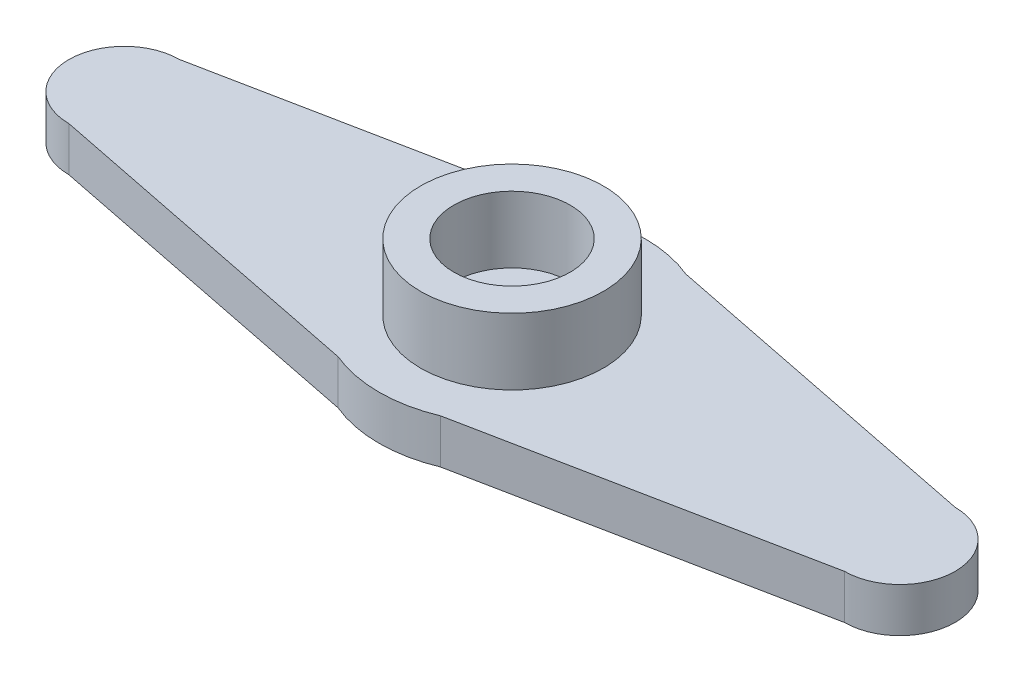
ISO-10303-21;
HEADER;
FILE_DESCRIPTION(('STEP AP214'),'2;1');
FILE_NAME('part.step','',(''),(''),'','','');
FILE_SCHEMA(('AUTOMOTIVE_DESIGN { 1 0 10303 214 1 1 1 1 }'));
ENDSEC;
DATA;
#1=APPLICATION_CONTEXT('core data for automotive mechanical design processes');
#2=APPLICATION_PROTOCOL_DEFINITION('international standard','automotive_design',2000,#1);
#3=PRODUCT_CONTEXT('',#1,'mechanical');
#4=PRODUCT('Part','Part','',(#3));
#5=PRODUCT_RELATED_PRODUCT_CATEGORY('part','',(#4));
#6=PRODUCT_DEFINITION_FORMATION('','',#4);
#7=PRODUCT_DEFINITION_CONTEXT('part definition',#1,'design');
#8=PRODUCT_DEFINITION('design','',#6,#7);
#9=PRODUCT_DEFINITION_SHAPE('','',#8);
#10=(LENGTH_UNIT() NAMED_UNIT(*) SI_UNIT(.MILLI.,.METRE.));
#11=(NAMED_UNIT(*) PLANE_ANGLE_UNIT() SI_UNIT($,.RADIAN.));
#12=(NAMED_UNIT(*) SI_UNIT($,.STERADIAN.) SOLID_ANGLE_UNIT());
#13=UNCERTAINTY_MEASURE_WITH_UNIT(LENGTH_MEASURE(1.E-05),#10,'distance_accuracy_value','');
#14=(GEOMETRIC_REPRESENTATION_CONTEXT(3) GLOBAL_UNCERTAINTY_ASSIGNED_CONTEXT((#13)) GLOBAL_UNIT_ASSIGNED_CONTEXT((#10,
#11,#12)) REPRESENTATION_CONTEXT('',''));
#15=CARTESIAN_POINT('',(0.,0.,0.));
#16=DIRECTION('',(0.,0.,1.));
#17=DIRECTION('',(1.,0.,0.));
#18=AXIS2_PLACEMENT_3D('',#15,#16,#17);
#19=CARTESIAN_POINT('',(17.5,2.,0.));
#20=DIRECTION('',(0.,-1.,0.));
#21=DIRECTION('',(0.,0.,-1.));
#22=AXIS2_PLACEMENT_3D('',#19,#20,#21);
#23=CYLINDRICAL_SURFACE('',#22,2.5);
#24=CARTESIAN_POINT('',(17.5,0.,0.));
#25=DIRECTION('',(0.,1.,0.));
#26=DIRECTION('',(0.,0.,1.));
#27=AXIS2_PLACEMENT_3D('',#24,#25,#26);
#28=CIRCLE('',#27,2.5);
#29=CARTESIAN_POINT('',(17.5,0.,2.5));
#30=VERTEX_POINT('',#29);
#31=CARTESIAN_POINT('',(17.5,0.,-2.5));
#32=VERTEX_POINT('',#31);
#33=EDGE_CURVE('E129',#30,#32,#28,.T.);
#34=ORIENTED_EDGE('',*,*,#33,.T.);
#35=DIRECTION('',(0.,-1.,0.));
#36=VECTOR('',#35,1.);
#37=CARTESIAN_POINT('',(17.5,2.,-2.5));
#38=LINE('',#37,#36);
#39=CARTESIAN_POINT('',(17.5,2.,-2.5));
#40=VERTEX_POINT('',#39);
#41=EDGE_CURVE('E40',#40,#32,#38,.T.);
#42=ORIENTED_EDGE('',*,*,#41,.F.);
#43=CARTESIAN_POINT('',(17.5,2.,0.));
#44=DIRECTION('',(0.,1.,0.));
#45=DIRECTION('',(0.,0.,1.));
#46=AXIS2_PLACEMENT_3D('',#43,#44,#45);
#47=CIRCLE('',#46,2.5);
#48=CARTESIAN_POINT('',(17.5,2.,2.5));
#49=VERTEX_POINT('',#48);
#50=EDGE_CURVE('E144',#49,#40,#47,.T.);
#51=ORIENTED_EDGE('',*,*,#50,.F.);
#52=DIRECTION('',(0.,-1.,0.));
#53=VECTOR('',#52,1.);
#54=CARTESIAN_POINT('',(17.5,2.,2.5));
#55=LINE('',#54,#53);
#56=EDGE_CURVE('E125',#49,#30,#55,.T.);
#57=ORIENTED_EDGE('',*,*,#56,.T.);
#58=EDGE_LOOP('',(#34,#42,#51,#57));
#59=FACE_BOUND('',#58,.T.);
#60=ADVANCED_FACE('F32',(#59),#23,.T.);
#61=CARTESIAN_POINT('',(17.5,2.,-2.5));
#62=DIRECTION('',(-0.196116135138184,0.,0.98058067569092));
#63=DIRECTION('',(0.98058067569092,0.,0.196116135138184));
#64=AXIS2_PLACEMENT_3D('',#61,#62,#63);
#65=PLANE('',#64);
#66=DIRECTION('',(-0.98058067569092,0.,-0.196116135138184));
#67=VECTOR('',#66,1.);
#68=CARTESIAN_POINT('',(17.5,0.,-2.5));
#69=LINE('',#68,#67);
#70=CARTESIAN_POINT('',(2.30769230769231,0.,-5.53846153846154));
#71=VERTEX_POINT('',#70);
#72=EDGE_CURVE('E132',#32,#71,#69,.T.);
#73=ORIENTED_EDGE('',*,*,#72,.T.);
#74=DIRECTION('',(0.,-1.,0.));
#75=VECTOR('',#74,1.);
#76=CARTESIAN_POINT('',(2.30769230769231,2.,-5.53846153846154));
#77=LINE('',#76,#75);
#78=CARTESIAN_POINT('',(2.30769230769231,2.,-5.53846153846154));
#79=VERTEX_POINT('',#78);
#80=EDGE_CURVE('E154',#79,#71,#77,.T.);
#81=ORIENTED_EDGE('',*,*,#80,.F.);
#82=DIRECTION('',(-0.98058067569092,0.,-0.196116135138184));
#83=VECTOR('',#82,1.);
#84=CARTESIAN_POINT('',(17.5,2.,-2.5));
#85=LINE('',#84,#83);
#86=EDGE_CURVE('E92',#40,#79,#85,.T.);
#87=ORIENTED_EDGE('',*,*,#86,.F.);
#88=ORIENTED_EDGE('',*,*,#41,.T.);
#89=EDGE_LOOP('',(#73,#81,#87,#88));
#90=FACE_BOUND('',#89,.T.);
#91=ADVANCED_FACE('F157',(#90),#65,.F.);
#92=CARTESIAN_POINT('',(0.,2.,0.));
#93=DIRECTION('',(0.,-1.,0.));
#94=DIRECTION('',(0.,0.,-1.));
#95=AXIS2_PLACEMENT_3D('',#92,#93,#94);
#96=CYLINDRICAL_SURFACE('',#95,6.);
#97=CARTESIAN_POINT('',(0.,0.,0.));
#98=DIRECTION('',(0.,1.,0.));
#99=DIRECTION('',(0.,0.,1.));
#100=AXIS2_PLACEMENT_3D('',#97,#98,#99);
#101=CIRCLE('',#100,6.);
#102=CARTESIAN_POINT('',(-2.30769230769231,0.,-5.53846153846154));
#103=VERTEX_POINT('',#102);
#104=EDGE_CURVE('E135',#71,#103,#101,.T.);
#105=ORIENTED_EDGE('',*,*,#104,.T.);
#106=DIRECTION('',(0.,-1.,0.));
#107=VECTOR('',#106,1.);
#108=CARTESIAN_POINT('',(-2.30769230769231,2.,-5.53846153846154));
#109=LINE('',#108,#107);
#110=CARTESIAN_POINT('',(-2.30769230769231,2.,-5.53846153846154));
#111=VERTEX_POINT('',#110);
#112=EDGE_CURVE('E151',#111,#103,#109,.T.);
#113=ORIENTED_EDGE('',*,*,#112,.F.);
#114=CARTESIAN_POINT('',(0.,2.,0.));
#115=DIRECTION('',(0.,1.,0.));
#116=DIRECTION('',(0.,0.,1.));
#117=AXIS2_PLACEMENT_3D('',#114,#115,#116);
#118=CIRCLE('',#117,6.);
#119=EDGE_CURVE('E175',#79,#111,#118,.T.);
#120=ORIENTED_EDGE('',*,*,#119,.F.);
#121=ORIENTED_EDGE('',*,*,#80,.T.);
#122=EDGE_LOOP('',(#105,#113,#120,#121));
#123=FACE_BOUND('',#122,.T.);
#124=ADVANCED_FACE('F168',(#123),#96,.T.);
#125=CARTESIAN_POINT('',(-2.30769230769231,2.,-5.53846153846154));
#126=DIRECTION('',(0.196116135138184,0.,0.98058067569092));
#127=DIRECTION('',(0.98058067569092,0.,-0.196116135138184));
#128=AXIS2_PLACEMENT_3D('',#125,#126,#127);
#129=PLANE('',#128);
#130=DIRECTION('',(-0.98058067569092,0.,0.196116135138184));
#131=VECTOR('',#130,1.);
#132=CARTESIAN_POINT('',(-2.30769230769231,0.,-5.53846153846154));
#133=LINE('',#132,#131);
#134=CARTESIAN_POINT('',(-17.5,0.,-2.5));
#135=VERTEX_POINT('',#134);
#136=EDGE_CURVE('E137',#103,#135,#133,.T.);
#137=ORIENTED_EDGE('',*,*,#136,.T.);
#138=DIRECTION('',(0.,-1.,0.));
#139=VECTOR('',#138,1.);
#140=CARTESIAN_POINT('',(-17.5,2.,-2.5));
#141=LINE('',#140,#139);
#142=CARTESIAN_POINT('',(-17.5,2.,-2.5));
#143=VERTEX_POINT('',#142);
#144=EDGE_CURVE('E148',#143,#135,#141,.T.);
#145=ORIENTED_EDGE('',*,*,#144,.F.);
#146=DIRECTION('',(-0.98058067569092,0.,0.196116135138184));
#147=VECTOR('',#146,1.);
#148=CARTESIAN_POINT('',(-2.30769230769231,2.,-5.53846153846154));
#149=LINE('',#148,#147);
#150=EDGE_CURVE('E174',#111,#143,#149,.T.);
#151=ORIENTED_EDGE('',*,*,#150,.F.);
#152=ORIENTED_EDGE('',*,*,#112,.T.);
#153=EDGE_LOOP('',(#137,#145,#151,#152));
#154=FACE_BOUND('',#153,.T.);
#155=ADVANCED_FACE('F172',(#154),#129,.F.);
#156=CARTESIAN_POINT('',(-17.5,2.,0.));
#157=DIRECTION('',(0.,-1.,0.));
#158=DIRECTION('',(0.,0.,-1.));
#159=AXIS2_PLACEMENT_3D('',#156,#157,#158);
#160=CYLINDRICAL_SURFACE('',#159,2.5);
#161=CARTESIAN_POINT('',(-17.5,0.,0.));
#162=DIRECTION('',(0.,1.,0.));
#163=DIRECTION('',(0.,0.,1.));
#164=AXIS2_PLACEMENT_3D('',#161,#162,#163);
#165=CIRCLE('',#164,2.5);
#166=CARTESIAN_POINT('',(-17.5,0.,2.5));
#167=VERTEX_POINT('',#166);
#168=EDGE_CURVE('E139',#135,#167,#165,.T.);
#169=ORIENTED_EDGE('',*,*,#168,.T.);
#170=DIRECTION('',(0.,-1.,0.));
#171=VECTOR('',#170,1.);
#172=CARTESIAN_POINT('',(-17.5,2.,2.5));
#173=LINE('',#172,#171);
#174=CARTESIAN_POINT('',(-17.5,2.,2.5));
#175=VERTEX_POINT('',#174);
#176=EDGE_CURVE('E120',#175,#167,#173,.T.);
#177=ORIENTED_EDGE('',*,*,#176,.F.);
#178=CARTESIAN_POINT('',(-17.5,2.,0.));
#179=DIRECTION('',(0.,1.,0.));
#180=DIRECTION('',(0.,0.,1.));
#181=AXIS2_PLACEMENT_3D('',#178,#179,#180);
#182=CIRCLE('',#181,2.5);
#183=EDGE_CURVE('E111',#143,#175,#182,.T.);
#184=ORIENTED_EDGE('',*,*,#183,.F.);
#185=ORIENTED_EDGE('',*,*,#144,.T.);
#186=EDGE_LOOP('',(#169,#177,#184,#185));
#187=FACE_BOUND('',#186,.T.);
#188=ADVANCED_FACE('F217',(#187),#160,.T.);
#189=CARTESIAN_POINT('',(-2.30769230769231,2.,5.53846153846154));
#190=DIRECTION('',(0.196116135138184,0.,-0.98058067569092));
#191=DIRECTION('',(-0.98058067569092,0.,-0.196116135138184));
#192=AXIS2_PLACEMENT_3D('',#189,#190,#191);
#193=PLANE('',#192);
#194=DIRECTION('',(0.98058067569092,0.,0.196116135138184));
#195=VECTOR('',#194,1.);
#196=CARTESIAN_POINT('',(-2.30769230769231,0.,5.53846153846154));
#197=LINE('',#196,#195);
#198=CARTESIAN_POINT('',(-2.30769230769231,0.,5.53846153846154));
#199=VERTEX_POINT('',#198);
#200=EDGE_CURVE('E119',#167,#199,#197,.T.);
#201=ORIENTED_EDGE('',*,*,#200,.T.);
#202=DIRECTION('',(0.,-1.,0.));
#203=VECTOR('',#202,1.);
#204=CARTESIAN_POINT('',(-2.30769230769231,2.,5.53846153846154));
#205=LINE('',#204,#203);
#206=CARTESIAN_POINT('',(-2.30769230769231,2.,5.53846153846154));
#207=VERTEX_POINT('',#206);
#208=EDGE_CURVE('E116',#207,#199,#205,.T.);
#209=ORIENTED_EDGE('',*,*,#208,.F.);
#210=DIRECTION('',(0.98058067569092,0.,0.196116135138184));
#211=VECTOR('',#210,1.);
#212=CARTESIAN_POINT('',(-2.30769230769231,2.,5.53846153846154));
#213=LINE('',#212,#211);
#214=EDGE_CURVE('E105',#175,#207,#213,.T.);
#215=ORIENTED_EDGE('',*,*,#214,.F.);
#216=ORIENTED_EDGE('',*,*,#176,.T.);
#217=EDGE_LOOP('',(#201,#209,#215,#216));
#218=FACE_BOUND('',#217,.T.);
#219=ADVANCED_FACE('F117',(#218),#193,.F.);
#220=CARTESIAN_POINT('',(0.,2.,0.));
#221=DIRECTION('',(0.,-1.,0.));
#222=DIRECTION('',(0.,0.,-1.));
#223=AXIS2_PLACEMENT_3D('',#220,#221,#222);
#224=CYLINDRICAL_SURFACE('',#223,6.);
#225=CARTESIAN_POINT('',(0.,0.,0.));
#226=DIRECTION('',(0.,1.,0.));
#227=DIRECTION('',(0.,0.,1.));
#228=AXIS2_PLACEMENT_3D('',#225,#226,#227);
#229=CIRCLE('',#228,6.);
#230=CARTESIAN_POINT('',(2.30769230769231,0.,5.53846153846154));
#231=VERTEX_POINT('',#230);
#232=EDGE_CURVE('E77',#199,#231,#229,.T.);
#233=ORIENTED_EDGE('',*,*,#232,.T.);
#234=DIRECTION('',(0.,-1.,0.));
#235=VECTOR('',#234,1.);
#236=CARTESIAN_POINT('',(2.30769230769231,2.,5.53846153846154));
#237=LINE('',#236,#235);
#238=CARTESIAN_POINT('',(2.30769230769231,2.,5.53846153846154));
#239=VERTEX_POINT('',#238);
#240=EDGE_CURVE('E121',#239,#231,#237,.T.);
#241=ORIENTED_EDGE('',*,*,#240,.F.);
#242=CARTESIAN_POINT('',(0.,2.,0.));
#243=DIRECTION('',(0.,1.,0.));
#244=DIRECTION('',(0.,0.,1.));
#245=AXIS2_PLACEMENT_3D('',#242,#243,#244);
#246=CIRCLE('',#245,6.);
#247=EDGE_CURVE('E109',#207,#239,#246,.T.);
#248=ORIENTED_EDGE('',*,*,#247,.F.);
#249=ORIENTED_EDGE('',*,*,#208,.T.);
#250=EDGE_LOOP('',(#233,#241,#248,#249));
#251=FACE_BOUND('',#250,.T.);
#252=ADVANCED_FACE('F123',(#251),#224,.T.);
#253=CARTESIAN_POINT('',(17.5,2.,2.5));
#254=DIRECTION('',(-0.196116135138184,0.,-0.98058067569092));
#255=DIRECTION('',(-0.98058067569092,0.,0.196116135138184));
#256=AXIS2_PLACEMENT_3D('',#253,#254,#255);
#257=PLANE('',#256);
#258=DIRECTION('',(0.98058067569092,0.,-0.196116135138184));
#259=VECTOR('',#258,1.);
#260=CARTESIAN_POINT('',(17.5,0.,2.5));
#261=LINE('',#260,#259);
#262=EDGE_CURVE('E83',#231,#30,#261,.T.);
#263=ORIENTED_EDGE('',*,*,#262,.T.);
#264=ORIENTED_EDGE('',*,*,#56,.F.);
#265=DIRECTION('',(0.98058067569092,0.,-0.196116135138184));
#266=VECTOR('',#265,1.);
#267=CARTESIAN_POINT('',(17.5,2.,2.5));
#268=LINE('',#267,#266);
#269=EDGE_CURVE('E48',#239,#49,#268,.T.);
#270=ORIENTED_EDGE('',*,*,#269,.F.);
#271=ORIENTED_EDGE('',*,*,#240,.T.);
#272=EDGE_LOOP('',(#263,#264,#270,#271));
#273=FACE_BOUND('',#272,.T.);
#274=ADVANCED_FACE('F225',(#273),#257,.F.);
#275=CARTESIAN_POINT('',(17.5,2.,0.));
#276=DIRECTION('',(0.,1.,0.));
#277=DIRECTION('',(0.,0.,1.));
#278=AXIS2_PLACEMENT_3D('',#275,#276,#277);
#279=PLANE('',#278);
#280=CARTESIAN_POINT('',(0.,2.,0.));
#281=DIRECTION('',(0.,1.,0.));
#282=DIRECTION('',(0.,0.,1.));
#283=AXIS2_PLACEMENT_3D('',#280,#281,#282);
#284=CIRCLE('',#283,4.125);
#285=CARTESIAN_POINT('',(0.,2.,4.125));
#286=VERTEX_POINT('',#285);
#287=EDGE_CURVE('E181',#286,#286,#284,.T.);
#288=ORIENTED_EDGE('',*,*,#287,.F.);
#289=EDGE_LOOP('',(#288));
#290=FACE_BOUND('',#289,.T.);
#291=ORIENTED_EDGE('',*,*,#50,.T.);
#292=ORIENTED_EDGE('',*,*,#86,.T.);
#293=ORIENTED_EDGE('',*,*,#119,.T.);
#294=ORIENTED_EDGE('',*,*,#150,.T.);
#295=ORIENTED_EDGE('',*,*,#183,.T.);
#296=ORIENTED_EDGE('',*,*,#214,.T.);
#297=ORIENTED_EDGE('',*,*,#247,.T.);
#298=ORIENTED_EDGE('',*,*,#269,.T.);
#299=EDGE_LOOP('',(#291,#292,#293,#294,#295,#296,#297,#298));
#300=FACE_BOUND('',#299,.T.);
#301=ADVANCED_FACE('F107',(#290,#300),#279,.T.);
#302=CARTESIAN_POINT('',(17.5,0.,0.));
#303=DIRECTION('',(0.,1.,0.));
#304=DIRECTION('',(0.,0.,1.));
#305=AXIS2_PLACEMENT_3D('',#302,#303,#304);
#306=PLANE('',#305);
#307=ORIENTED_EDGE('',*,*,#33,.F.);
#308=ORIENTED_EDGE('',*,*,#262,.F.);
#309=ORIENTED_EDGE('',*,*,#232,.F.);
#310=ORIENTED_EDGE('',*,*,#200,.F.);
#311=ORIENTED_EDGE('',*,*,#168,.F.);
#312=ORIENTED_EDGE('',*,*,#136,.F.);
#313=ORIENTED_EDGE('',*,*,#104,.F.);
#314=ORIENTED_EDGE('',*,*,#72,.F.);
#315=EDGE_LOOP('',(#307,#308,#309,#310,#311,#312,#313,#314));
#316=FACE_BOUND('',#315,.T.);
#317=ADVANCED_FACE('F162',(#316),#306,.F.);
#318=CARTESIAN_POINT('',(0.,5.,0.));
#319=DIRECTION('',(0.,1.,0.));
#320=DIRECTION('',(0.,0.,1.));
#321=AXIS2_PLACEMENT_3D('',#318,#319,#320);
#322=PLANE('',#321);
#323=CARTESIAN_POINT('',(0.,5.,0.));
#324=DIRECTION('',(0.,1.,0.));
#325=DIRECTION('',(0.,0.,1.));
#326=AXIS2_PLACEMENT_3D('',#323,#324,#325);
#327=CIRCLE('',#326,4.125);
#328=CARTESIAN_POINT('',(0.,5.,4.125));
#329=VERTEX_POINT('',#328);
#330=EDGE_CURVE('E133',#329,#329,#327,.T.);
#331=ORIENTED_EDGE('',*,*,#330,.T.);
#332=EDGE_LOOP('',(#331));
#333=FACE_BOUND('',#332,.T.);
#334=CARTESIAN_POINT('',(0.,5.,0.));
#335=DIRECTION('',(0.,1.,0.));
#336=DIRECTION('',(0.,0.,1.));
#337=AXIS2_PLACEMENT_3D('',#334,#335,#336);
#338=CIRCLE('',#337,2.625);
#339=CARTESIAN_POINT('',(0.,5.,2.625));
#340=VERTEX_POINT('',#339);
#341=EDGE_CURVE('E184',#340,#340,#338,.T.);
#342=ORIENTED_EDGE('',*,*,#341,.F.);
#343=EDGE_LOOP('',(#342));
#344=FACE_BOUND('',#343,.T.);
#345=ADVANCED_FACE('F193',(#333,#344),#322,.T.);
#346=CARTESIAN_POINT('',(0.,5.,0.));
#347=DIRECTION('',(0.,-1.,0.));
#348=DIRECTION('',(0.,0.,-1.));
#349=AXIS2_PLACEMENT_3D('',#346,#347,#348);
#350=CYLINDRICAL_SURFACE('',#349,4.125);
#351=ORIENTED_EDGE('',*,*,#330,.F.);
#352=EDGE_LOOP('',(#351));
#353=FACE_BOUND('',#352,.T.);
#354=ORIENTED_EDGE('',*,*,#287,.T.);
#355=EDGE_LOOP('',(#354));
#356=FACE_BOUND('',#355,.T.);
#357=ADVANCED_FACE('F195',(#353,#356),#350,.T.);
#358=CARTESIAN_POINT('',(0.,5.,0.));
#359=DIRECTION('',(0.,-1.,0.));
#360=DIRECTION('',(0.,0.,-1.));
#361=AXIS2_PLACEMENT_3D('',#358,#359,#360);
#362=CYLINDRICAL_SURFACE('',#361,2.625);
#363=ORIENTED_EDGE('',*,*,#341,.T.);
#364=EDGE_LOOP('',(#363));
#365=FACE_BOUND('',#364,.T.);
#366=CARTESIAN_POINT('',(0.,2.,0.));
#367=DIRECTION('',(0.,1.,0.));
#368=DIRECTION('',(0.,0.,1.));
#369=AXIS2_PLACEMENT_3D('',#366,#367,#368);
#370=CIRCLE('',#369,2.625);
#371=CARTESIAN_POINT('',(0.,2.,2.625));
#372=VERTEX_POINT('',#371);
#373=EDGE_CURVE('E11',#372,#372,#370,.F.);
#374=ORIENTED_EDGE('',*,*,#373,.T.);
#375=EDGE_LOOP('',(#374));
#376=FACE_BOUND('',#375,.T.);
#377=ADVANCED_FACE('F190',(#365,#376),#362,.F.);
#378=ORIENTED_EDGE('',*,*,#373,.F.);
#379=EDGE_LOOP('',(#378));
#380=FACE_BOUND('',#379,.T.);
#381=ADVANCED_FACE('F230',(#380),#279,.T.);
#382=CLOSED_SHELL('',(#60,#91,#124,#155,#188,#219,#252,#274,#301,#317,#345,#357,#377,#381));
#383=MANIFOLD_SOLID_BREP('B2',#382);
#384=ADVANCED_BREP_SHAPE_REPRESENTATION('',(#18,#383),#14);
#385=SHAPE_DEFINITION_REPRESENTATION(#9,#384);
ENDSEC;
END-ISO-10303-21;
